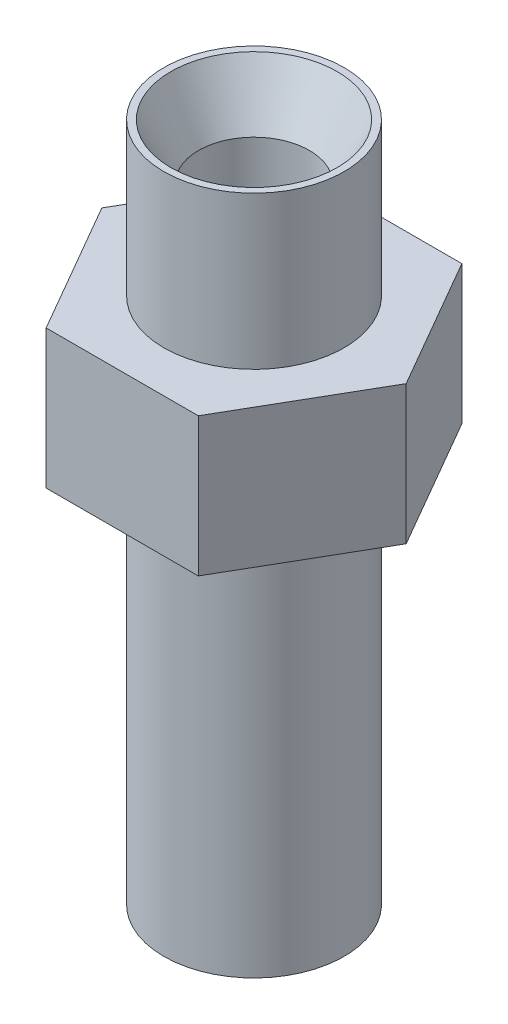
ISO-10303-21;
HEADER;
FILE_DESCRIPTION(('STEP AP214'),'2;1');
FILE_NAME('part.step','',(''),(''),'','','');
FILE_SCHEMA(('AUTOMOTIVE_DESIGN { 1 0 10303 214 1 1 1 1 }'));
ENDSEC;
DATA;
#1=APPLICATION_CONTEXT('core data for automotive mechanical design processes');
#2=APPLICATION_PROTOCOL_DEFINITION('international standard','automotive_design',2000,#1);
#3=PRODUCT_CONTEXT('',#1,'mechanical');
#4=PRODUCT('Part','Part','',(#3));
#5=PRODUCT_RELATED_PRODUCT_CATEGORY('part','',(#4));
#6=PRODUCT_DEFINITION_FORMATION('','',#4);
#7=PRODUCT_DEFINITION_CONTEXT('part definition',#1,'design');
#8=PRODUCT_DEFINITION('design','',#6,#7);
#9=PRODUCT_DEFINITION_SHAPE('','',#8);
#10=(LENGTH_UNIT() NAMED_UNIT(*) SI_UNIT(.MILLI.,.METRE.));
#11=(NAMED_UNIT(*) PLANE_ANGLE_UNIT() SI_UNIT($,.RADIAN.));
#12=(NAMED_UNIT(*) SI_UNIT($,.STERADIAN.) SOLID_ANGLE_UNIT());
#13=UNCERTAINTY_MEASURE_WITH_UNIT(LENGTH_MEASURE(1.E-05),#10,'distance_accuracy_value','');
#14=(GEOMETRIC_REPRESENTATION_CONTEXT(3) GLOBAL_UNCERTAINTY_ASSIGNED_CONTEXT((#13)) GLOBAL_UNIT_ASSIGNED_CONTEXT((#10,
#11,#12)) REPRESENTATION_CONTEXT('',''));
#15=CARTESIAN_POINT('',(0.,0.,0.));
#16=DIRECTION('',(0.,0.,1.));
#17=DIRECTION('',(1.,0.,0.));
#18=AXIS2_PLACEMENT_3D('',#15,#16,#17);
#19=CARTESIAN_POINT('',(5.48482755730156,10.,9.49999999999994));
#20=DIRECTION('',(-0.866025403784442,0.,-0.499999999999995));
#21=DIRECTION('',(-0.499999999999995,0.,0.866025403784442));
#22=AXIS2_PLACEMENT_3D('',#19,#20,#21);
#23=PLANE('',#22);
#24=DIRECTION('',(0.499999999999995,0.,-0.866025403784441));
#25=VECTOR('',#24,1.);
#26=CARTESIAN_POINT('',(5.48482755730156,0.,9.49999999999994));
#27=LINE('',#26,#25);
#28=CARTESIAN_POINT('',(5.48482755730156,0.,9.49999999999994));
#29=VERTEX_POINT('',#28);
#30=CARTESIAN_POINT('',(10.9696551146029,0.,0.));
#31=VERTEX_POINT('',#30);
#32=EDGE_CURVE('E118',#29,#31,#27,.T.);
#33=ORIENTED_EDGE('',*,*,#32,.T.);
#34=DIRECTION('',(0.,-1.,0.));
#35=VECTOR('',#34,1.);
#36=CARTESIAN_POINT('',(10.9696551146029,10.,0.));
#37=LINE('',#36,#35);
#38=CARTESIAN_POINT('',(10.9696551146029,10.,0.));
#39=VERTEX_POINT('',#38);
#40=EDGE_CURVE('E136',#39,#31,#37,.T.);
#41=ORIENTED_EDGE('',*,*,#40,.F.);
#42=DIRECTION('',(0.499999999999995,0.,-0.866025403784441));
#43=VECTOR('',#42,1.);
#44=CARTESIAN_POINT('',(5.48482755730156,10.,9.49999999999994));
#45=LINE('',#44,#43);
#46=CARTESIAN_POINT('',(5.48482755730156,10.,9.49999999999994));
#47=VERTEX_POINT('',#46);
#48=EDGE_CURVE('E129',#47,#39,#45,.T.);
#49=ORIENTED_EDGE('',*,*,#48,.F.);
#50=DIRECTION('',(0.,-1.,0.));
#51=VECTOR('',#50,1.);
#52=CARTESIAN_POINT('',(5.48482755730156,10.,9.49999999999994));
#53=LINE('',#52,#51);
#54=EDGE_CURVE('E114',#47,#29,#53,.T.);
#55=ORIENTED_EDGE('',*,*,#54,.T.);
#56=EDGE_LOOP('',(#33,#41,#49,#55));
#57=FACE_BOUND('',#56,.T.);
#58=ADVANCED_FACE('F32',(#57),#23,.F.);
#59=CARTESIAN_POINT('',(10.9696551146029,10.,0.));
#60=DIRECTION('',(-0.866025403784438,0.,0.500000000000001));
#61=DIRECTION('',(0.500000000000001,0.,0.866025403784438));
#62=AXIS2_PLACEMENT_3D('',#59,#60,#61);
#63=PLANE('',#62);
#64=DIRECTION('',(-0.500000000000001,0.,-0.866025403784438));
#65=VECTOR('',#64,1.);
#66=CARTESIAN_POINT('',(10.9696551146029,0.,0.));
#67=LINE('',#66,#65);
#68=CARTESIAN_POINT('',(5.48482755730143,0.,-9.50000000000002));
#69=VERTEX_POINT('',#68);
#70=EDGE_CURVE('E121',#31,#69,#67,.T.);
#71=ORIENTED_EDGE('',*,*,#70,.T.);
#72=DIRECTION('',(0.,-1.,0.));
#73=VECTOR('',#72,1.);
#74=CARTESIAN_POINT('',(5.48482755730143,10.,-9.50000000000002));
#75=LINE('',#74,#73);
#76=CARTESIAN_POINT('',(5.48482755730143,10.,-9.50000000000002));
#77=VERTEX_POINT('',#76);
#78=EDGE_CURVE('E133',#77,#69,#75,.T.);
#79=ORIENTED_EDGE('',*,*,#78,.F.);
#80=DIRECTION('',(-0.500000000000001,0.,-0.866025403784438));
#81=VECTOR('',#80,1.);
#82=CARTESIAN_POINT('',(10.9696551146029,10.,0.));
#83=LINE('',#82,#81);
#84=EDGE_CURVE('E87',#39,#77,#83,.T.);
#85=ORIENTED_EDGE('',*,*,#84,.F.);
#86=ORIENTED_EDGE('',*,*,#40,.T.);
#87=EDGE_LOOP('',(#71,#79,#85,#86));
#88=FACE_BOUND('',#87,.T.);
#89=ADVANCED_FACE('F163',(#88),#63,.F.);
#90=CARTESIAN_POINT('',(5.48482755730143,10.,-9.50000000000002));
#91=DIRECTION('',(0.,0.,1.));
#92=DIRECTION('',(1.,0.,0.));
#93=AXIS2_PLACEMENT_3D('',#90,#91,#92);
#94=PLANE('',#93);
#95=DIRECTION('',(-1.,0.,0.));
#96=VECTOR('',#95,1.);
#97=CARTESIAN_POINT('',(5.48482755730143,0.,-9.50000000000002));
#98=LINE('',#97,#96);
#99=CARTESIAN_POINT('',(-5.48482755730149,0.,-9.49999999999998));
#100=VERTEX_POINT('',#99);
#101=EDGE_CURVE('E124',#69,#100,#98,.T.);
#102=ORIENTED_EDGE('',*,*,#101,.T.);
#103=DIRECTION('',(0.,-1.,0.));
#104=VECTOR('',#103,1.);
#105=CARTESIAN_POINT('',(-5.48482755730149,10.,-9.49999999999998));
#106=LINE('',#105,#104);
#107=CARTESIAN_POINT('',(-5.48482755730149,10.,-9.49999999999998));
#108=VERTEX_POINT('',#107);
#109=EDGE_CURVE('E109',#108,#100,#106,.T.);
#110=ORIENTED_EDGE('',*,*,#109,.F.);
#111=DIRECTION('',(-1.,0.,0.));
#112=VECTOR('',#111,1.);
#113=CARTESIAN_POINT('',(5.48482755730143,10.,-9.50000000000002));
#114=LINE('',#113,#112);
#115=EDGE_CURVE('E100',#77,#108,#114,.T.);
#116=ORIENTED_EDGE('',*,*,#115,.F.);
#117=ORIENTED_EDGE('',*,*,#78,.T.);
#118=EDGE_LOOP('',(#102,#110,#116,#117));
#119=FACE_BOUND('',#118,.T.);
#120=ADVANCED_FACE('F169',(#119),#94,.F.);
#121=CARTESIAN_POINT('',(-5.48482755730149,10.,-9.49999999999998));
#122=DIRECTION('',(0.866025403784442,0.,0.499999999999995));
#123=DIRECTION('',(0.499999999999995,0.,-0.866025403784442));
#124=AXIS2_PLACEMENT_3D('',#121,#122,#123);
#125=PLANE('',#124);
#126=DIRECTION('',(-0.499999999999995,0.,0.866025403784442));
#127=VECTOR('',#126,1.);
#128=CARTESIAN_POINT('',(-5.48482755730149,0.,-9.49999999999998));
#129=LINE('',#128,#127);
#130=CARTESIAN_POINT('',(-10.9696551146029,0.,0.));
#131=VERTEX_POINT('',#130);
#132=EDGE_CURVE('E108',#100,#131,#129,.T.);
#133=ORIENTED_EDGE('',*,*,#132,.T.);
#134=DIRECTION('',(0.,-1.,0.));
#135=VECTOR('',#134,1.);
#136=CARTESIAN_POINT('',(-10.9696551146029,10.,0.));
#137=LINE('',#136,#135);
#138=CARTESIAN_POINT('',(-10.9696551146029,10.,0.));
#139=VERTEX_POINT('',#138);
#140=EDGE_CURVE('E105',#139,#131,#137,.T.);
#141=ORIENTED_EDGE('',*,*,#140,.F.);
#142=DIRECTION('',(-0.499999999999995,0.,0.866025403784442));
#143=VECTOR('',#142,1.);
#144=CARTESIAN_POINT('',(-5.48482755730149,10.,-9.49999999999998));
#145=LINE('',#144,#143);
#146=EDGE_CURVE('E94',#108,#139,#145,.T.);
#147=ORIENTED_EDGE('',*,*,#146,.F.);
#148=ORIENTED_EDGE('',*,*,#109,.T.);
#149=EDGE_LOOP('',(#133,#141,#147,#148));
#150=FACE_BOUND('',#149,.T.);
#151=ADVANCED_FACE('F106',(#150),#125,.F.);
#152=CARTESIAN_POINT('',(-10.9696551146029,10.,0.));
#153=DIRECTION('',(0.866025403784434,0.,-0.500000000000007));
#154=DIRECTION('',(-0.500000000000007,0.,-0.866025403784435));
#155=AXIS2_PLACEMENT_3D('',#152,#153,#154);
#156=PLANE('',#155);
#157=DIRECTION('',(0.500000000000007,0.,0.866025403784435));
#158=VECTOR('',#157,1.);
#159=CARTESIAN_POINT('',(-10.9696551146029,0.,0.));
#160=LINE('',#159,#158);
#161=CARTESIAN_POINT('',(-5.48482755730136,0.,9.50000000000006));
#162=VERTEX_POINT('',#161);
#163=EDGE_CURVE('E72',#131,#162,#160,.T.);
#164=ORIENTED_EDGE('',*,*,#163,.T.);
#165=DIRECTION('',(0.,-1.,0.));
#166=VECTOR('',#165,1.);
#167=CARTESIAN_POINT('',(-5.48482755730136,10.,9.50000000000006));
#168=LINE('',#167,#166);
#169=CARTESIAN_POINT('',(-5.48482755730136,10.,9.50000000000006));
#170=VERTEX_POINT('',#169);
#171=EDGE_CURVE('E110',#170,#162,#168,.T.);
#172=ORIENTED_EDGE('',*,*,#171,.F.);
#173=DIRECTION('',(0.500000000000007,0.,0.866025403784435));
#174=VECTOR('',#173,1.);
#175=CARTESIAN_POINT('',(-10.9696551146029,10.,0.));
#176=LINE('',#175,#174);
#177=EDGE_CURVE('E98',#139,#170,#176,.T.);
#178=ORIENTED_EDGE('',*,*,#177,.F.);
#179=ORIENTED_EDGE('',*,*,#140,.T.);
#180=EDGE_LOOP('',(#164,#172,#178,#179));
#181=FACE_BOUND('',#180,.T.);
#182=ADVANCED_FACE('F112',(#181),#156,.F.);
#183=CARTESIAN_POINT('',(-5.48482755730136,10.,9.50000000000006));
#184=DIRECTION('',(0.,0.,-1.));
#185=DIRECTION('',(-1.,0.,0.));
#186=AXIS2_PLACEMENT_3D('',#183,#184,#185);
#187=PLANE('',#186);
#188=DIRECTION('',(1.,0.,0.));
#189=VECTOR('',#188,1.);
#190=CARTESIAN_POINT('',(-5.48482755730136,0.,9.50000000000006));
#191=LINE('',#190,#189);
#192=EDGE_CURVE('E78',#162,#29,#191,.T.);
#193=ORIENTED_EDGE('',*,*,#192,.T.);
#194=ORIENTED_EDGE('',*,*,#54,.F.);
#195=DIRECTION('',(1.,0.,0.));
#196=VECTOR('',#195,1.);
#197=CARTESIAN_POINT('',(-5.48482755730136,10.,9.50000000000006));
#198=LINE('',#197,#196);
#199=EDGE_CURVE('E49',#170,#47,#198,.T.);
#200=ORIENTED_EDGE('',*,*,#199,.F.);
#201=ORIENTED_EDGE('',*,*,#171,.T.);
#202=EDGE_LOOP('',(#193,#194,#200,#201));
#203=FACE_BOUND('',#202,.T.);
#204=ADVANCED_FACE('F179',(#203),#187,.F.);
#205=CARTESIAN_POINT('',(0.,10.,0.));
#206=DIRECTION('',(0.,1.,0.));
#207=DIRECTION('',(0.,0.,1.));
#208=AXIS2_PLACEMENT_3D('',#205,#206,#207);
#209=PLANE('',#208);
#210=CARTESIAN_POINT('',(0.,10.,0.));
#211=DIRECTION('',(0.,1.,0.));
#212=DIRECTION('',(0.,0.,1.));
#213=AXIS2_PLACEMENT_3D('',#210,#211,#212);
#214=CIRCLE('',#213,6.5);
#215=CARTESIAN_POINT('',(0.,10.,6.5));
#216=VERTEX_POINT('',#215);
#217=EDGE_CURVE('E138',#216,#216,#214,.T.);
#218=ORIENTED_EDGE('',*,*,#217,.F.);
#219=EDGE_LOOP('',(#218));
#220=FACE_BOUND('',#219,.T.);
#221=ORIENTED_EDGE('',*,*,#48,.T.);
#222=ORIENTED_EDGE('',*,*,#84,.T.);
#223=ORIENTED_EDGE('',*,*,#115,.T.);
#224=ORIENTED_EDGE('',*,*,#146,.T.);
#225=ORIENTED_EDGE('',*,*,#177,.T.);
#226=ORIENTED_EDGE('',*,*,#199,.T.);
#227=EDGE_LOOP('',(#221,#222,#223,#224,#225,#226));
#228=FACE_BOUND('',#227,.T.);
#229=ADVANCED_FACE('F96',(#220,#228),#209,.T.);
#230=CARTESIAN_POINT('',(0.,0.,0.));
#231=DIRECTION('',(0.,1.,0.));
#232=DIRECTION('',(0.,0.,1.));
#233=AXIS2_PLACEMENT_3D('',#230,#231,#232);
#234=PLANE('',#233);
#235=CARTESIAN_POINT('',(0.,0.,0.));
#236=DIRECTION('',(0.,1.,0.));
#237=DIRECTION('',(0.,0.,1.));
#238=AXIS2_PLACEMENT_3D('',#235,#236,#237);
#239=CIRCLE('',#238,6.5);
#240=CARTESIAN_POINT('',(0.,0.,6.5));
#241=VERTEX_POINT('',#240);
#242=EDGE_CURVE('E122',#241,#241,#239,.T.);
#243=ORIENTED_EDGE('',*,*,#242,.T.);
#244=EDGE_LOOP('',(#243));
#245=FACE_BOUND('',#244,.T.);
#246=ORIENTED_EDGE('',*,*,#32,.F.);
#247=ORIENTED_EDGE('',*,*,#192,.F.);
#248=ORIENTED_EDGE('',*,*,#163,.F.);
#249=ORIENTED_EDGE('',*,*,#132,.F.);
#250=ORIENTED_EDGE('',*,*,#101,.F.);
#251=ORIENTED_EDGE('',*,*,#70,.F.);
#252=EDGE_LOOP('',(#246,#247,#248,#249,#250,#251));
#253=FACE_BOUND('',#252,.T.);
#254=ADVANCED_FACE('F182',(#245,#253),#234,.F.);
#255=CARTESIAN_POINT('',(0.,-28.,0.));
#256=DIRECTION('',(0.,1.,0.));
#257=DIRECTION('',(0.,0.,1.));
#258=AXIS2_PLACEMENT_3D('',#255,#256,#257);
#259=PLANE('',#258);
#260=CARTESIAN_POINT('',(0.,-28.,0.));
#261=DIRECTION('',(0.,1.,0.));
#262=DIRECTION('',(0.,0.,1.));
#263=AXIS2_PLACEMENT_3D('',#260,#261,#262);
#264=CIRCLE('',#263,5.56257125301341);
#265=CARTESIAN_POINT('',(0.,-28.,5.56257125301341));
#266=VERTEX_POINT('',#265);
#267=EDGE_CURVE('E41',#266,#266,#264,.T.);
#268=ORIENTED_EDGE('',*,*,#267,.T.);
#269=EDGE_LOOP('',(#268));
#270=FACE_BOUND('',#269,.T.);
#271=CARTESIAN_POINT('',(0.,-28.,0.));
#272=DIRECTION('',(0.,1.,0.));
#273=DIRECTION('',(0.,0.,1.));
#274=AXIS2_PLACEMENT_3D('',#271,#272,#273);
#275=CIRCLE('',#274,6.5);
#276=CARTESIAN_POINT('',(0.,-28.,6.5));
#277=VERTEX_POINT('',#276);
#278=EDGE_CURVE('E141',#277,#277,#275,.T.);
#279=ORIENTED_EDGE('',*,*,#278,.F.);
#280=EDGE_LOOP('',(#279));
#281=FACE_BOUND('',#280,.T.);
#282=ADVANCED_FACE('F150',(#270,#281),#259,.F.);
#283=CARTESIAN_POINT('',(0.,-28.,0.));
#284=DIRECTION('',(0.,1.,0.));
#285=DIRECTION('',(0.,0.,1.));
#286=AXIS2_PLACEMENT_3D('',#283,#284,#285);
#287=CYLINDRICAL_SURFACE('',#286,6.5);
#288=ORIENTED_EDGE('',*,*,#278,.T.);
#289=EDGE_LOOP('',(#288));
#290=FACE_BOUND('',#289,.T.);
#291=ORIENTED_EDGE('',*,*,#242,.F.);
#292=EDGE_LOOP('',(#291));
#293=FACE_BOUND('',#292,.T.);
#294=ADVANCED_FACE('F193',(#290,#293),#287,.T.);
#295=ORIENTED_EDGE('',*,*,#217,.T.);
#296=EDGE_LOOP('',(#295));
#297=FACE_BOUND('',#296,.T.);
#298=CARTESIAN_POINT('',(0.,21.,0.));
#299=DIRECTION('',(0.,1.,0.));
#300=DIRECTION('',(0.,0.,1.));
#301=AXIS2_PLACEMENT_3D('',#298,#299,#300);
#302=CIRCLE('',#301,6.5);
#303=CARTESIAN_POINT('',(0.,21.,6.5));
#304=VERTEX_POINT('',#303);
#305=EDGE_CURVE('E305',#304,#304,#302,.T.);
#306=ORIENTED_EDGE('',*,*,#305,.F.);
#307=EDGE_LOOP('',(#306));
#308=FACE_BOUND('',#307,.T.);
#309=ADVANCED_FACE('F189',(#297,#308),#287,.T.);
#310=CARTESIAN_POINT('',(0.,21.,0.));
#311=DIRECTION('',(0.,1.,0.));
#312=DIRECTION('',(0.,0.,1.));
#313=AXIS2_PLACEMENT_3D('',#310,#311,#312);
#314=PLANE('',#313);
#315=CARTESIAN_POINT('',(0.,21.,0.));
#316=DIRECTION('',(0.,1.,0.));
#317=DIRECTION('',(0.,0.,1.));
#318=AXIS2_PLACEMENT_3D('',#315,#316,#317);
#319=CIRCLE('',#318,6.00000000000006);
#320=CARTESIAN_POINT('',(0.,21.,6.00000000000006));
#321=VERTEX_POINT('',#320);
#322=EDGE_CURVE('E145',#321,#321,#319,.F.);
#323=ORIENTED_EDGE('',*,*,#322,.T.);
#324=EDGE_LOOP('',(#323));
#325=FACE_BOUND('',#324,.T.);
#326=ORIENTED_EDGE('',*,*,#305,.T.);
#327=EDGE_LOOP('',(#326));
#328=FACE_BOUND('',#327,.T.);
#329=ADVANCED_FACE('F192',(#325,#328),#314,.T.);
#330=CARTESIAN_POINT('',(0.,-36.,0.));
#331=DIRECTION('',(0.,1.,0.));
#332=DIRECTION('',(0.,0.,1.));
#333=AXIS2_PLACEMENT_3D('',#330,#331,#332);
#334=CYLINDRICAL_SURFACE('',#333,4.);
#335=CARTESIAN_POINT('',(0.,-26.,0.));
#336=DIRECTION('',(0.,1.,0.));
#337=DIRECTION('',(0.,0.,1.));
#338=AXIS2_PLACEMENT_3D('',#335,#336,#337);
#339=CIRCLE('',#338,4.);
#340=CARTESIAN_POINT('',(0.,-26.,4.));
#341=VERTEX_POINT('',#340);
#342=EDGE_CURVE('E11',#341,#341,#339,.F.);
#343=CARTESIAN_POINT('',(0.,17.0747789889896,0.));
#344=DIRECTION('',(0.,1.,0.));
#345=DIRECTION('',(0.,0.,1.));
#346=AXIS2_PLACEMENT_3D('',#343,#344,#345);
#347=CIRCLE('',#346,4.);
#348=CARTESIAN_POINT('',(0.,17.0747789889896,4.));
#349=VERTEX_POINT('',#348);
#350=EDGE_CURVE('E142',#349,#349,#347,.T.);
#351=CARTESIAN_POINT('',(0.,-26.,4.));
#352=CARTESIAN_POINT('',(0.,-25.5513043855314,4.));
#353=CARTESIAN_POINT('',(0.,-25.1026087710628,4.));
#354=CARTESIAN_POINT('',(0.,-24.2052175421255,4.));
#355=CARTESIAN_POINT('',(0.,-23.7565219276568,4.));
#356=CARTESIAN_POINT('',(0.,-22.8591306987195,4.));
#357=CARTESIAN_POINT('',(0.,-22.4104350842509,4.));
#358=CARTESIAN_POINT('',(0.,-21.5130438553136,4.));
#359=CARTESIAN_POINT('',(0.,-21.064348240845,4.));
#360=CARTESIAN_POINT('',(0.,-20.1669570119077,4.));
#361=CARTESIAN_POINT('',(0.,-19.7182613974391,4.));
#362=CARTESIAN_POINT('',(0.,-18.8208701685018,4.));
#363=CARTESIAN_POINT('',(0.,-18.3721745540331,4.));
#364=CARTESIAN_POINT('',(0.,-17.4747833250958,4.));
#365=CARTESIAN_POINT('',(0.,-17.0260877106272,4.));
#366=CARTESIAN_POINT('',(0.,-16.1286964816899,4.));
#367=CARTESIAN_POINT('',(0.,-15.6800008672213,4.));
#368=CARTESIAN_POINT('',(0.,-14.782609638284,4.));
#369=CARTESIAN_POINT('',(0.,-14.3339140238153,4.));
#370=CARTESIAN_POINT('',(0.,-13.4365227948781,4.));
#371=CARTESIAN_POINT('',(0.,-12.9878271804094,4.));
#372=CARTESIAN_POINT('',(0.,-12.0904359514721,4.));
#373=CARTESIAN_POINT('',(0.,-11.6417403370035,4.));
#374=CARTESIAN_POINT('',(0.,-10.7443491080662,4.));
#375=CARTESIAN_POINT('',(0.,-10.2956534935976,4.));
#376=CARTESIAN_POINT('',(0.,-9.39826226466029,4.));
#377=CARTESIAN_POINT('',(0.,-8.94956665019165,4.));
#378=CARTESIAN_POINT('',(0.,-8.05217542125436,4.));
#379=CARTESIAN_POINT('',(0.,-7.60347980678572,4.));
#380=CARTESIAN_POINT('',(0.,-6.70608857784844,4.));
#381=CARTESIAN_POINT('',(0.,-6.25739296337979,4.));
#382=CARTESIAN_POINT('',(0.,-5.36000173444251,4.));
#383=CARTESIAN_POINT('',(0.,-4.91130611997387,4.));
#384=CARTESIAN_POINT('',(0.,-4.01391489103659,4.));
#385=CARTESIAN_POINT('',(0.,-3.56521927656795,4.));
#386=CARTESIAN_POINT('',(0.,-2.66782804763067,4.));
#387=CARTESIAN_POINT('',(0.,-2.21913243316203,4.));
#388=CARTESIAN_POINT('',(0.,-1.32174120422474,4.));
#389=CARTESIAN_POINT('',(0.,-0.873045589756096,4.));
#390=CARTESIAN_POINT('',(0.,0.0243456391811891,4.));
#391=CARTESIAN_POINT('',(0.,0.473041253649831,4.));
#392=CARTESIAN_POINT('',(0.,1.37043248258711,4.));
#393=CARTESIAN_POINT('',(0.,1.81912809705576,4.));
#394=CARTESIAN_POINT('',(0.,2.71651932599304,4.));
#395=CARTESIAN_POINT('',(0.,3.16521494046169,4.));
#396=CARTESIAN_POINT('',(0.,4.06260616939897,4.));
#397=CARTESIAN_POINT('',(0.,4.51130178386761,4.));
#398=CARTESIAN_POINT('',(0.,5.4086930128049,4.));
#399=CARTESIAN_POINT('',(0.,5.85738862727354,4.));
#400=CARTESIAN_POINT('',(0.,6.75477985621082,4.));
#401=CARTESIAN_POINT('',(0.,7.20347547067946,4.));
#402=CARTESIAN_POINT('',(0.,8.10086669961674,4.));
#403=CARTESIAN_POINT('',(0.,8.54956231408539,4.));
#404=CARTESIAN_POINT('',(0.,9.44695354302267,4.));
#405=CARTESIAN_POINT('',(0.,9.89564915749131,4.));
#406=CARTESIAN_POINT('',(0.,10.7930403864286,4.));
#407=CARTESIAN_POINT('',(0.,11.2417360008972,4.));
#408=CARTESIAN_POINT('',(0.,12.1391272298345,4.));
#409=CARTESIAN_POINT('',(0.,12.5878228443032,4.));
#410=CARTESIAN_POINT('',(0.,13.4852140732404,4.));
#411=CARTESIAN_POINT('',(0.,13.9339096877091,4.));
#412=CARTESIAN_POINT('',(0.,14.8313009166464,4.));
#413=CARTESIAN_POINT('',(0.,15.279996531115,4.));
#414=CARTESIAN_POINT('',(0.,16.1773877600523,4.));
#415=CARTESIAN_POINT('',(0.,16.6260833745209,4.));
#416=CARTESIAN_POINT('',(0.,17.0747789889896,4.));
#417=B_SPLINE_CURVE_WITH_KNOTS('',3,(#351,#352,#353,#354,#355,#356,#357,#358,#359,#360,#361,
#362,#363,#364,#365,#366,#367,#368,#369,#370,#371,#372,#373,#374,#375,#376,#377,#378,#379,#380,
#381,#382,#383,#384,#385,#386,#387,#388,#389,#390,#391,#392,#393,#394,#395,#396,#397,#398,#399,
#400,#401,#402,#403,#404,#405,#406,#407,#408,#409,#410,#411,#412,#413,#414,#415,#416),
.UNSPECIFIED.,.F.,.F.,(4,2,2,2,2,2,2,2,2,2,2,2,2,2,2,2,2,2,2,2,2,2,2,2,2,2,2,2,2,2,2,2,4),(0.,
1.34608684340592,2.69217368681185,4.03826053021778,5.38434737362371,6.73043421702963,
8.07652106043555,9.42260790384148,10.7686947472474,12.1147815906533,13.4608684340593,
14.8069552774652,16.1530421208711,17.499128964277,18.845215807683,20.1913026510889,
21.5373894944948,22.8834763379007,24.2295631813067,25.5756500247126,26.9217368681185,
28.2678237115244,29.6139105549304,30.9599973983363,32.3060842417422,33.6521710851481,
34.9982579285541,36.34434477196,37.6904316153659,39.0365184587718,40.3826053021778,
41.7286921455837,43.0747789889896),.UNSPECIFIED.);
#418=EDGE_CURVE('BSEAM159',#341,#349,#417,.T.);
#419=ORIENTED_EDGE('',*,*,#342,.T.);
#420=ORIENTED_EDGE('',*,*,#350,.T.);
#421=ORIENTED_EDGE('',*,*,#418,.T.);
#422=ORIENTED_EDGE('',*,*,#418,.F.);
#423=EDGE_LOOP('',(#419,#421,#420,#422));
#424=FACE_BOUND('',#423,.T.);
#425=ADVANCED_FACE('F159',(#424),#334,.F.);
#426=CARTESIAN_POINT('',(0.,17.0747789889896,0.));
#427=DIRECTION('',(0.,1.,0.));
#428=DIRECTION('',(0.,0.,1.));
#429=AXIS2_PLACEMENT_3D('',#426,#427,#428);
#430=CONICAL_SURFACE('',#429,4.,0.47123889803847);
#431=ORIENTED_EDGE('',*,*,#322,.F.);
#432=EDGE_LOOP('',(#431));
#433=FACE_BOUND('',#432,.T.);
#434=ORIENTED_EDGE('',*,*,#350,.F.);
#435=EDGE_LOOP('',(#434));
#436=FACE_BOUND('',#435,.T.);
#437=ADVANCED_FACE('F154',(#433,#436),#430,.F.);
#438=CARTESIAN_POINT('',(0.,-28.,0.));
#439=DIRECTION('',(0.,-1.,0.));
#440=DIRECTION('',(0.,0.,-1.));
#441=AXIS2_PLACEMENT_3D('',#438,#439,#440);
#442=CONICAL_SURFACE('',#441,5.56257125301341,0.663225115757845);
#443=ORIENTED_EDGE('',*,*,#342,.F.);
#444=EDGE_LOOP('',(#443));
#445=FACE_BOUND('',#444,.T.);
#446=ORIENTED_EDGE('',*,*,#267,.F.);
#447=EDGE_LOOP('',(#446));
#448=FACE_BOUND('',#447,.T.);
#449=ADVANCED_FACE('F34',(#445,#448),#442,.F.);
#450=CLOSED_SHELL('',(#58,#89,#120,#151,#182,#204,#229,#254,#282,#294,#309,#329,#425,#437,#449));
#451=MANIFOLD_SOLID_BREP('B2',#450);
#452=ADVANCED_BREP_SHAPE_REPRESENTATION('',(#18,#451),#14);
#453=SHAPE_DEFINITION_REPRESENTATION(#9,#452);
ENDSEC;
END-ISO-10303-21;
